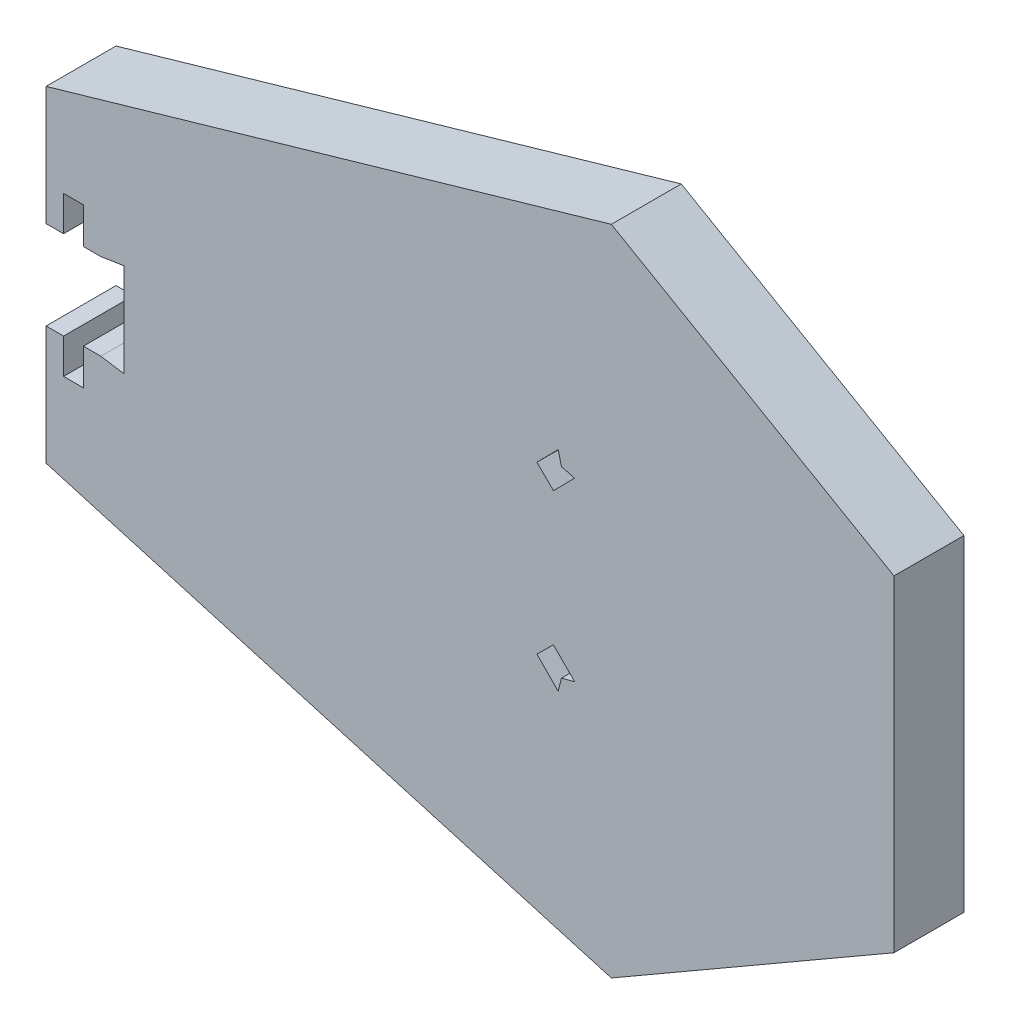
ISO-10303-21;
HEADER;
FILE_DESCRIPTION(('STEP AP214'),'2;1');
FILE_NAME('part.step','',(''),(''),'','','');
FILE_SCHEMA(('AUTOMOTIVE_DESIGN { 1 0 10303 214 1 1 1 1 }'));
ENDSEC;
DATA;
#1=APPLICATION_CONTEXT('core data for automotive mechanical design processes');
#2=APPLICATION_PROTOCOL_DEFINITION('international standard','automotive_design',2000,#1);
#3=PRODUCT_CONTEXT('',#1,'mechanical');
#4=PRODUCT('Part','Part','',(#3));
#5=PRODUCT_RELATED_PRODUCT_CATEGORY('part','',(#4));
#6=PRODUCT_DEFINITION_FORMATION('','',#4);
#7=PRODUCT_DEFINITION_CONTEXT('part definition',#1,'design');
#8=PRODUCT_DEFINITION('design','',#6,#7);
#9=PRODUCT_DEFINITION_SHAPE('','',#8);
#10=(LENGTH_UNIT() NAMED_UNIT(*) SI_UNIT(.MILLI.,.METRE.));
#11=(NAMED_UNIT(*) PLANE_ANGLE_UNIT() SI_UNIT($,.RADIAN.));
#12=(NAMED_UNIT(*) SI_UNIT($,.STERADIAN.) SOLID_ANGLE_UNIT());
#13=UNCERTAINTY_MEASURE_WITH_UNIT(LENGTH_MEASURE(1.E-05),#10,'distance_accuracy_value','');
#14=(GEOMETRIC_REPRESENTATION_CONTEXT(3) GLOBAL_UNCERTAINTY_ASSIGNED_CONTEXT((#13)) GLOBAL_UNIT_ASSIGNED_CONTEXT((#10,
#11,#12)) REPRESENTATION_CONTEXT('',''));
#15=CARTESIAN_POINT('',(0.,0.,0.));
#16=DIRECTION('',(0.,0.,1.));
#17=DIRECTION('',(1.,0.,0.));
#18=AXIS2_PLACEMENT_3D('',#15,#16,#17);
#19=CARTESIAN_POINT('',(-3.26682362399667,3.21868149985037,6.));
#20=DIRECTION('',(0.712336033670005,-0.701838567717168,0.));
#21=DIRECTION('',(0.701838567717168,0.712336033670005,0.));
#22=AXIS2_PLACEMENT_3D('',#19,#20,#21);
#23=PLANE('',#22);
#24=DIRECTION('',(-0.701838567717168,-0.712336033670005,0.));
#25=VECTOR('',#24,1.);
#26=CARTESIAN_POINT('',(-3.26682362399667,3.21868149985037,0.));
#27=LINE('',#26,#25);
#28=CARTESIAN_POINT('',(2.4087145761827,8.97910926261704,0.));
#29=VERTEX_POINT('',#28);
#30=CARTESIAN_POINT('',(0.584447895170022,7.12755685201684,0.));
#31=VERTEX_POINT('',#30);
#32=EDGE_CURVE('E399',#29,#31,#27,.T.);
#33=ORIENTED_EDGE('',*,*,#32,.F.);
#34=DIRECTION('',(0.,0.,-1.));
#35=VECTOR('',#34,1.);
#36=CARTESIAN_POINT('',(2.4087145761827,8.97910926261704,6.));
#37=LINE('',#36,#35);
#38=CARTESIAN_POINT('',(2.4087145761827,8.97910926261704,6.));
#39=VERTEX_POINT('',#38);
#40=EDGE_CURVE('E422',#39,#29,#37,.T.);
#41=ORIENTED_EDGE('',*,*,#40,.F.);
#42=DIRECTION('',(-0.701838567717168,-0.712336033670005,0.));
#43=VECTOR('',#42,1.);
#44=CARTESIAN_POINT('',(-3.26682362399667,3.21868149985037,6.));
#45=LINE('',#44,#43);
#46=CARTESIAN_POINT('',(0.584447895170022,7.12755685201684,6.));
#47=VERTEX_POINT('',#46);
#48=EDGE_CURVE('E343',#39,#47,#45,.T.);
#49=ORIENTED_EDGE('',*,*,#48,.T.);
#50=DIRECTION('',(0.,0.,-1.));
#51=VECTOR('',#50,1.);
#52=CARTESIAN_POINT('',(0.584447895170022,7.12755685201684,6.));
#53=LINE('',#52,#51);
#54=EDGE_CURVE('E413',#47,#31,#53,.T.);
#55=ORIENTED_EDGE('',*,*,#54,.T.);
#56=EDGE_LOOP('',(#33,#41,#49,#55));
#57=FACE_BOUND('',#56,.T.);
#58=ADVANCED_FACE('F35',(#57),#23,.T.);
#59=CARTESIAN_POINT('',(4.43325491605289,1.14578469708355,6.));
#60=DIRECTION('',(-0.968186432146917,-0.250229959450548,0.));
#61=DIRECTION('',(0.250229959450548,-0.968186432146917,0.));
#62=AXIS2_PLACEMENT_3D('',#59,#60,#61);
#63=PLANE('',#62);
#64=DIRECTION('',(-0.250229959450548,0.968186432146917,0.));
#65=VECTOR('',#64,1.);
#66=CARTESIAN_POINT('',(4.43325491605289,1.14578469708355,0.));
#67=LINE('',#66,#65);
#68=CARTESIAN_POINT('',(2.7004254455055,7.85042544550625,0.));
#69=VERTEX_POINT('',#68);
#70=EDGE_CURVE('E402',#69,#29,#67,.T.);
#71=ORIENTED_EDGE('',*,*,#70,.F.);
#72=DIRECTION('',(0.,0.,-1.));
#73=VECTOR('',#72,1.);
#74=CARTESIAN_POINT('',(2.7004254455055,7.85042544550625,6.));
#75=LINE('',#74,#73);
#76=CARTESIAN_POINT('',(2.7004254455055,7.85042544550625,6.));
#77=VERTEX_POINT('',#76);
#78=EDGE_CURVE('E420',#77,#69,#75,.T.);
#79=ORIENTED_EDGE('',*,*,#78,.F.);
#80=DIRECTION('',(-0.250229959450548,0.968186432146917,0.));
#81=VECTOR('',#80,1.);
#82=CARTESIAN_POINT('',(4.43325491605289,1.14578469708355,6.));
#83=LINE('',#82,#81);
#84=EDGE_CURVE('E346',#77,#39,#83,.T.);
#85=ORIENTED_EDGE('',*,*,#84,.T.);
#86=ORIENTED_EDGE('',*,*,#40,.T.);
#87=EDGE_LOOP('',(#71,#79,#85,#86));
#88=FACE_BOUND('',#87,.T.);
#89=ADVANCED_FACE('F546',(#88),#63,.T.);
#90=CARTESIAN_POINT('',(2.07100392519156,8.01310085209733,6.));
#91=DIRECTION('',(-0.250229959450549,-0.968186432146917,0.));
#92=DIRECTION('',(0.968186432146917,-0.250229959450549,0.));
#93=AXIS2_PLACEMENT_3D('',#90,#91,#92);
#94=PLANE('',#93);
#95=DIRECTION('',(-0.968186432146917,0.250229959450549,0.));
#96=VECTOR('',#95,1.);
#97=CARTESIAN_POINT('',(2.07100392519156,8.01310085209733,0.));
#98=LINE('',#97,#96);
#99=CARTESIAN_POINT('',(3.81927842247489,7.56125537891345,0.));
#100=VERTEX_POINT('',#99);
#101=EDGE_CURVE('E405',#100,#69,#98,.T.);
#102=ORIENTED_EDGE('',*,*,#101,.F.);
#103=DIRECTION('',(0.,0.,-1.));
#104=VECTOR('',#103,1.);
#105=CARTESIAN_POINT('',(3.81927842247489,7.56125537891345,6.));
#106=LINE('',#105,#104);
#107=CARTESIAN_POINT('',(3.81927842247489,7.56125537891345,6.));
#108=VERTEX_POINT('',#107);
#109=EDGE_CURVE('E418',#108,#100,#106,.T.);
#110=ORIENTED_EDGE('',*,*,#109,.F.);
#111=DIRECTION('',(-0.968186432146917,0.250229959450549,0.));
#112=VECTOR('',#111,1.);
#113=CARTESIAN_POINT('',(2.07100392519156,8.01310085209733,6.));
#114=LINE('',#113,#112);
#115=EDGE_CURVE('E349',#108,#77,#114,.T.);
#116=ORIENTED_EDGE('',*,*,#115,.T.);
#117=ORIENTED_EDGE('',*,*,#78,.T.);
#118=EDGE_LOOP('',(#102,#110,#116,#117));
#119=FACE_BOUND('',#118,.T.);
#120=ADVANCED_FACE('F552',(#119),#94,.T.);
#121=CARTESIAN_POINT('',(-1.84222279419438,1.81507455214917,6.));
#122=DIRECTION('',(-0.712336033670005,0.701838567717168,0.));
#123=DIRECTION('',(-0.701838567717168,-0.712336033670005,0.));
#124=AXIS2_PLACEMENT_3D('',#121,#122,#123);
#125=PLANE('',#124);
#126=DIRECTION('',(0.701838567717168,0.712336033670005,0.));
#127=VECTOR('',#126,1.);
#128=CARTESIAN_POINT('',(-1.84222279419438,1.81507455214917,0.));
#129=LINE('',#128,#127);
#130=CARTESIAN_POINT('',(2.00904872497232,5.72394990431564,0.));
#131=VERTEX_POINT('',#130);
#132=EDGE_CURVE('E408',#131,#100,#129,.T.);
#133=ORIENTED_EDGE('',*,*,#132,.F.);
#134=DIRECTION('',(0.,0.,-1.));
#135=VECTOR('',#134,1.);
#136=CARTESIAN_POINT('',(2.00904872497232,5.72394990431564,6.));
#137=LINE('',#136,#135);
#138=CARTESIAN_POINT('',(2.00904872497232,5.72394990431564,6.));
#139=VERTEX_POINT('',#138);
#140=EDGE_CURVE('E415',#139,#131,#137,.T.);
#141=ORIENTED_EDGE('',*,*,#140,.F.);
#142=DIRECTION('',(0.701838567717168,0.712336033670005,0.));
#143=VECTOR('',#142,1.);
#144=CARTESIAN_POINT('',(-1.84222279419438,1.81507455214917,6.));
#145=LINE('',#144,#143);
#146=EDGE_CURVE('E352',#139,#108,#145,.T.);
#147=ORIENTED_EDGE('',*,*,#146,.T.);
#148=ORIENTED_EDGE('',*,*,#109,.T.);
#149=EDGE_LOOP('',(#133,#141,#147,#148));
#150=FACE_BOUND('',#149,.T.);
#151=ADVANCED_FACE('F577',(#150),#125,.T.);
#152=CARTESIAN_POINT('',(2.07100392519156,-8.01310085209733,6.));
#153=DIRECTION('',(0.250229959450549,-0.968186432146917,0.));
#154=DIRECTION('',(0.968186432146917,0.250229959450549,0.));
#155=AXIS2_PLACEMENT_3D('',#152,#153,#154);
#156=PLANE('',#155);
#157=DIRECTION('',(-0.968186432146917,-0.250229959450549,0.));
#158=VECTOR('',#157,1.);
#159=CARTESIAN_POINT('',(2.07100392519156,-8.01310085209733,0.));
#160=LINE('',#159,#158);
#161=CARTESIAN_POINT('',(3.81927842247489,-7.56125537891345,0.));
#162=VERTEX_POINT('',#161);
#163=CARTESIAN_POINT('',(2.7004254455055,-7.85042544550625,0.));
#164=VERTEX_POINT('',#163);
#165=EDGE_CURVE('E388',#162,#164,#160,.T.);
#166=ORIENTED_EDGE('',*,*,#165,.T.);
#167=DIRECTION('',(0.,0.,-1.));
#168=VECTOR('',#167,1.);
#169=CARTESIAN_POINT('',(2.7004254455055,-7.85042544550625,6.));
#170=LINE('',#169,#168);
#171=CARTESIAN_POINT('',(2.7004254455055,-7.85042544550625,6.));
#172=VERTEX_POINT('',#171);
#173=EDGE_CURVE('E416',#172,#164,#170,.T.);
#174=ORIENTED_EDGE('',*,*,#173,.F.);
#175=DIRECTION('',(-0.968186432146917,-0.250229959450549,0.));
#176=VECTOR('',#175,1.);
#177=CARTESIAN_POINT('',(2.07100392519156,-8.01310085209733,6.));
#178=LINE('',#177,#176);
#179=CARTESIAN_POINT('',(3.81927842247489,-7.56125537891345,6.));
#180=VERTEX_POINT('',#179);
#181=EDGE_CURVE('E332',#180,#172,#178,.T.);
#182=ORIENTED_EDGE('',*,*,#181,.F.);
#183=DIRECTION('',(0.,0.,-1.));
#184=VECTOR('',#183,1.);
#185=CARTESIAN_POINT('',(3.81927842247489,-7.56125537891345,6.));
#186=LINE('',#185,#184);
#187=EDGE_CURVE('E424',#180,#162,#186,.T.);
#188=ORIENTED_EDGE('',*,*,#187,.T.);
#189=EDGE_LOOP('',(#166,#174,#182,#188));
#190=FACE_BOUND('',#189,.T.);
#191=ADVANCED_FACE('F573',(#190),#156,.F.);
#192=CARTESIAN_POINT('',(4.43325491605289,-1.14578469708355,6.));
#193=DIRECTION('',(0.968186432146917,-0.250229959450548,0.));
#194=DIRECTION('',(0.250229959450548,0.968186432146917,0.));
#195=AXIS2_PLACEMENT_3D('',#192,#193,#194);
#196=PLANE('',#195);
#197=DIRECTION('',(-0.250229959450548,-0.968186432146917,0.));
#198=VECTOR('',#197,1.);
#199=CARTESIAN_POINT('',(4.43325491605289,-1.14578469708355,0.));
#200=LINE('',#199,#198);
#201=CARTESIAN_POINT('',(2.4087145761827,-8.97910926261704,0.));
#202=VERTEX_POINT('',#201);
#203=EDGE_CURVE('E391',#164,#202,#200,.T.);
#204=ORIENTED_EDGE('',*,*,#203,.T.);
#205=DIRECTION('',(0.,0.,-1.));
#206=VECTOR('',#205,1.);
#207=CARTESIAN_POINT('',(2.4087145761827,-8.97910926261704,6.));
#208=LINE('',#207,#206);
#209=CARTESIAN_POINT('',(2.4087145761827,-8.97910926261704,6.));
#210=VERTEX_POINT('',#209);
#211=EDGE_CURVE('E434',#210,#202,#208,.T.);
#212=ORIENTED_EDGE('',*,*,#211,.F.);
#213=DIRECTION('',(-0.250229959450548,-0.968186432146917,0.));
#214=VECTOR('',#213,1.);
#215=CARTESIAN_POINT('',(4.43325491605289,-1.14578469708355,6.));
#216=LINE('',#215,#214);
#217=EDGE_CURVE('E335',#172,#210,#216,.T.);
#218=ORIENTED_EDGE('',*,*,#217,.F.);
#219=ORIENTED_EDGE('',*,*,#173,.T.);
#220=EDGE_LOOP('',(#204,#212,#218,#219));
#221=FACE_BOUND('',#220,.T.);
#222=ADVANCED_FACE('F569',(#221),#196,.F.);
#223=CARTESIAN_POINT('',(-3.26682362399667,-3.21868149985037,6.));
#224=DIRECTION('',(-0.712336033670005,-0.701838567717168,0.));
#225=DIRECTION('',(0.701838567717168,-0.712336033670005,0.));
#226=AXIS2_PLACEMENT_3D('',#223,#224,#225);
#227=PLANE('',#226);
#228=DIRECTION('',(-0.701838567717168,0.712336033670005,0.));
#229=VECTOR('',#228,1.);
#230=CARTESIAN_POINT('',(-3.26682362399667,-3.21868149985037,0.));
#231=LINE('',#230,#229);
#232=CARTESIAN_POINT('',(0.584447895170024,-7.12755685201684,0.));
#233=VERTEX_POINT('',#232);
#234=EDGE_CURVE('E393',#202,#233,#231,.T.);
#235=ORIENTED_EDGE('',*,*,#234,.T.);
#236=DIRECTION('',(0.,0.,-1.));
#237=VECTOR('',#236,1.);
#238=CARTESIAN_POINT('',(0.584447895170024,-7.12755685201684,6.));
#239=LINE('',#238,#237);
#240=CARTESIAN_POINT('',(0.584447895170024,-7.12755685201684,6.));
#241=VERTEX_POINT('',#240);
#242=EDGE_CURVE('E431',#241,#233,#239,.T.);
#243=ORIENTED_EDGE('',*,*,#242,.F.);
#244=DIRECTION('',(-0.701838567717168,0.712336033670005,0.));
#245=VECTOR('',#244,1.);
#246=CARTESIAN_POINT('',(-3.26682362399667,-3.21868149985037,6.));
#247=LINE('',#246,#245);
#248=EDGE_CURVE('E337',#210,#241,#247,.T.);
#249=ORIENTED_EDGE('',*,*,#248,.F.);
#250=ORIENTED_EDGE('',*,*,#211,.T.);
#251=EDGE_LOOP('',(#235,#243,#249,#250));
#252=FACE_BOUND('',#251,.T.);
#253=ADVANCED_FACE('F565',(#252),#227,.F.);
#254=CARTESIAN_POINT('',(3.8512715191667,-3.90887535216647,6.));
#255=DIRECTION('',(-0.701838567717168,0.712336033670004,0.));
#256=DIRECTION('',(-0.712336033670004,-0.701838567717168,0.));
#257=AXIS2_PLACEMENT_3D('',#254,#255,#256);
#258=PLANE('',#257);
#259=DIRECTION('',(0.712336033670004,0.701838567717168,0.));
#260=VECTOR('',#259,1.);
#261=CARTESIAN_POINT('',(3.8512715191667,-3.90887535216647,0.));
#262=LINE('',#261,#260);
#263=CARTESIAN_POINT('',(2.00904872497232,-5.72394990431564,0.));
#264=VERTEX_POINT('',#263);
#265=EDGE_CURVE('E395',#233,#264,#262,.T.);
#266=ORIENTED_EDGE('',*,*,#265,.T.);
#267=DIRECTION('',(0.,0.,-1.));
#268=VECTOR('',#267,1.);
#269=CARTESIAN_POINT('',(2.00904872497232,-5.72394990431564,6.));
#270=LINE('',#269,#268);
#271=CARTESIAN_POINT('',(2.00904872497232,-5.72394990431564,6.));
#272=VERTEX_POINT('',#271);
#273=EDGE_CURVE('E427',#272,#264,#270,.T.);
#274=ORIENTED_EDGE('',*,*,#273,.F.);
#275=DIRECTION('',(0.712336033670004,0.701838567717168,0.));
#276=VECTOR('',#275,1.);
#277=CARTESIAN_POINT('',(3.8512715191667,-3.90887535216647,6.));
#278=LINE('',#277,#276);
#279=EDGE_CURVE('E339',#241,#272,#278,.T.);
#280=ORIENTED_EDGE('',*,*,#279,.F.);
#281=ORIENTED_EDGE('',*,*,#242,.T.);
#282=EDGE_LOOP('',(#266,#274,#280,#281));
#283=FACE_BOUND('',#282,.T.);
#284=ADVANCED_FACE('F562',(#283),#258,.F.);
#285=CARTESIAN_POINT('',(31.2230669589464,0.,6.));
#286=DIRECTION('',(-1.,0.,0.));
#287=DIRECTION('',(0.,0.,1.));
#288=AXIS2_PLACEMENT_3D('',#285,#286,#287);
#289=PLANE('',#288);
#290=DIRECTION('',(0.,1.,0.));
#291=VECTOR('',#290,1.);
#292=CARTESIAN_POINT('',(31.2230669589464,0.,0.));
#293=LINE('',#292,#291);
#294=CARTESIAN_POINT('',(31.2230669589464,-14.,0.));
#295=VERTEX_POINT('',#294);
#296=CARTESIAN_POINT('',(31.2230669589464,14.,0.));
#297=VERTEX_POINT('',#296);
#298=EDGE_CURVE('E301',#295,#297,#293,.T.);
#299=ORIENTED_EDGE('',*,*,#298,.T.);
#300=DIRECTION('',(0.,0.,-1.));
#301=VECTOR('',#300,1.);
#302=CARTESIAN_POINT('',(31.2230669589464,14.,6.));
#303=LINE('',#302,#301);
#304=CARTESIAN_POINT('',(31.2230669589464,14.,6.));
#305=VERTEX_POINT('',#304);
#306=EDGE_CURVE('E428',#305,#297,#303,.T.);
#307=ORIENTED_EDGE('',*,*,#306,.F.);
#308=DIRECTION('',(0.,1.,0.));
#309=VECTOR('',#308,1.);
#310=CARTESIAN_POINT('',(31.2230669589464,0.,6.));
#311=LINE('',#310,#309);
#312=CARTESIAN_POINT('',(31.2230669589464,-14.,6.));
#313=VERTEX_POINT('',#312);
#314=EDGE_CURVE('E302',#313,#305,#311,.T.);
#315=ORIENTED_EDGE('',*,*,#314,.F.);
#316=DIRECTION('',(0.,0.,-1.));
#317=VECTOR('',#316,1.);
#318=CARTESIAN_POINT('',(31.2230669589464,-14.,6.));
#319=LINE('',#318,#317);
#320=EDGE_CURVE('E358',#313,#295,#319,.T.);
#321=ORIENTED_EDGE('',*,*,#320,.T.);
#322=EDGE_LOOP('',(#299,#307,#315,#321));
#323=FACE_BOUND('',#322,.T.);
#324=ADVANCED_FACE('F37',(#323),#289,.F.);
#325=CARTESIAN_POINT('',(13.8679445662277,24.0199845852551,6.));
#326=DIRECTION('',(-0.5,-0.866025403784438,0.));
#327=DIRECTION('',(0.866025403784439,-0.5,0.));
#328=AXIS2_PLACEMENT_3D('',#325,#326,#327);
#329=PLANE('',#328);
#330=DIRECTION('',(-0.866025403784439,0.5,0.));
#331=VECTOR('',#330,1.);
#332=CARTESIAN_POINT('',(13.8679445662277,24.0199845852551,0.));
#333=LINE('',#332,#331);
#334=CARTESIAN_POINT('',(6.97435565298217,28.,0.));
#335=VERTEX_POINT('',#334);
#336=EDGE_CURVE('E361',#297,#335,#333,.T.);
#337=ORIENTED_EDGE('',*,*,#336,.T.);
#338=DIRECTION('',(0.,0.,-1.));
#339=VECTOR('',#338,1.);
#340=CARTESIAN_POINT('',(6.97435565298217,28.,6.));
#341=LINE('',#340,#339);
#342=CARTESIAN_POINT('',(6.97435565298217,28.,6.));
#343=VERTEX_POINT('',#342);
#344=EDGE_CURVE('E460',#343,#335,#341,.T.);
#345=ORIENTED_EDGE('',*,*,#344,.F.);
#346=DIRECTION('',(-0.866025403784439,0.5,0.));
#347=VECTOR('',#346,1.);
#348=CARTESIAN_POINT('',(13.8679445662277,24.0199845852551,6.));
#349=LINE('',#348,#347);
#350=EDGE_CURVE('E305',#305,#343,#349,.T.);
#351=ORIENTED_EDGE('',*,*,#350,.F.);
#352=ORIENTED_EDGE('',*,*,#306,.T.);
#353=EDGE_LOOP('',(#337,#345,#351,#352));
#354=FACE_BOUND('',#353,.T.);
#355=ADVANCED_FACE('F465',(#354),#329,.F.);
#356=CARTESIAN_POINT('',(-6.92465304391345,23.9877017936892,6.));
#357=DIRECTION('',(-0.277350098112614,0.960768922830523,0.));
#358=DIRECTION('',(-0.960768922830523,-0.277350098112614,0.));
#359=AXIS2_PLACEMENT_3D('',#356,#357,#358);
#360=PLANE('',#359);
#361=DIRECTION('',(0.960768922830523,0.277350098112614,0.));
#362=VECTOR('',#361,1.);
#363=CARTESIAN_POINT('',(-6.92465304391345,23.9877017936892,0.));
#364=LINE('',#363,#362);
#365=CARTESIAN_POINT('',(-41.5230669589465,14.,0.));
#366=VERTEX_POINT('',#365);
#367=EDGE_CURVE('E364',#366,#335,#364,.T.);
#368=ORIENTED_EDGE('',*,*,#367,.F.);
#369=DIRECTION('',(0.,0.,-1.));
#370=VECTOR('',#369,1.);
#371=CARTESIAN_POINT('',(-41.5230669589465,14.,6.));
#372=LINE('',#371,#370);
#373=CARTESIAN_POINT('',(-41.5230669589465,14.,6.));
#374=VERTEX_POINT('',#373);
#375=EDGE_CURVE('E458',#374,#366,#372,.T.);
#376=ORIENTED_EDGE('',*,*,#375,.F.);
#377=DIRECTION('',(0.960768922830523,0.277350098112614,0.));
#378=VECTOR('',#377,1.);
#379=CARTESIAN_POINT('',(-6.92465304391345,23.9877017936892,6.));
#380=LINE('',#379,#378);
#381=EDGE_CURVE('E308',#374,#343,#380,.T.);
#382=ORIENTED_EDGE('',*,*,#381,.T.);
#383=ORIENTED_EDGE('',*,*,#344,.T.);
#384=EDGE_LOOP('',(#368,#376,#382,#383));
#385=FACE_BOUND('',#384,.T.);
#386=ADVANCED_FACE('F476',(#385),#360,.T.);
#387=CARTESIAN_POINT('',(-41.5230669589465,0.,6.));
#388=DIRECTION('',(1.,0.,0.));
#389=DIRECTION('',(0.,0.,-1.));
#390=AXIS2_PLACEMENT_3D('',#387,#388,#389);
#391=PLANE('',#390);
#392=DIRECTION('',(0.,-1.,0.));
#393=VECTOR('',#392,1.);
#394=CARTESIAN_POINT('',(-41.5230669589465,0.,0.));
#395=LINE('',#394,#393);
#396=CARTESIAN_POINT('',(-41.5230669589465,3.79999999999952,0.));
#397=VERTEX_POINT('',#396);
#398=EDGE_CURVE('E367',#366,#397,#395,.T.);
#399=ORIENTED_EDGE('',*,*,#398,.T.);
#400=DIRECTION('',(0.,0.,1.));
#401=VECTOR('',#400,1.);
#402=CARTESIAN_POINT('',(-41.5230669589465,3.79999999999952,6.));
#403=LINE('',#402,#401);
#404=CARTESIAN_POINT('',(-41.5230669589465,3.79999999999952,6.));
#405=VERTEX_POINT('',#404);
#406=EDGE_CURVE('E298',#397,#405,#403,.T.);
#407=ORIENTED_EDGE('',*,*,#406,.T.);
#408=DIRECTION('',(0.,-1.,0.));
#409=VECTOR('',#408,1.);
#410=CARTESIAN_POINT('',(-41.5230669589465,0.,6.));
#411=LINE('',#410,#409);
#412=EDGE_CURVE('E311',#374,#405,#411,.T.);
#413=ORIENTED_EDGE('',*,*,#412,.F.);
#414=ORIENTED_EDGE('',*,*,#375,.T.);
#415=EDGE_LOOP('',(#399,#407,#413,#414));
#416=FACE_BOUND('',#415,.T.);
#417=ADVANCED_FACE('F535',(#416),#391,.F.);
#418=CARTESIAN_POINT('',(0.,3.7,6.));
#419=DIRECTION('',(0.,1.,0.));
#420=DIRECTION('',(-1.,0.,0.));
#421=AXIS2_PLACEMENT_3D('',#418,#419,#420);
#422=PLANE('',#421);
#423=DIRECTION('',(1.,0.,0.));
#424=VECTOR('',#423,1.);
#425=CARTESIAN_POINT('',(0.,3.7,6.));
#426=LINE('',#425,#424);
#427=CARTESIAN_POINT('',(-38.3230669589467,3.7,6.));
#428=VERTEX_POINT('',#427);
#429=CARTESIAN_POINT('',(-36.8230669589465,3.7,6.));
#430=VERTEX_POINT('',#429);
#431=EDGE_CURVE('E314',#428,#430,#426,.T.);
#432=ORIENTED_EDGE('',*,*,#431,.F.);
#433=DIRECTION('',(0.,0.,-1.));
#434=VECTOR('',#433,1.);
#435=CARTESIAN_POINT('',(-38.3230669589467,3.7,6.));
#436=LINE('',#435,#434);
#437=CARTESIAN_POINT('',(-38.3230669589467,3.7,0.));
#438=VERTEX_POINT('',#437);
#439=EDGE_CURVE('E295',#428,#438,#436,.T.);
#440=ORIENTED_EDGE('',*,*,#439,.T.);
#441=DIRECTION('',(1.,0.,0.));
#442=VECTOR('',#441,1.);
#443=CARTESIAN_POINT('',(0.,3.7,0.));
#444=LINE('',#443,#442);
#445=CARTESIAN_POINT('',(-36.8230669589465,3.7,0.));
#446=VERTEX_POINT('',#445);
#447=EDGE_CURVE('E370',#438,#446,#444,.T.);
#448=ORIENTED_EDGE('',*,*,#447,.T.);
#449=DIRECTION('',(0.,0.,-1.));
#450=VECTOR('',#449,1.);
#451=CARTESIAN_POINT('',(-36.8230669589465,3.7,6.));
#452=LINE('',#451,#450);
#453=EDGE_CURVE('E455',#430,#446,#452,.T.);
#454=ORIENTED_EDGE('',*,*,#453,.F.);
#455=EDGE_LOOP('',(#432,#440,#448,#454));
#456=FACE_BOUND('',#455,.T.);
#457=ADVANCED_FACE('F522',(#456),#422,.F.);
#458=CARTESIAN_POINT('',(-1.46534877253605,9.28195054774533,6.));
#459=DIRECTION('',(-0.155939485229701,0.987766610564609,0.));
#460=DIRECTION('',(-0.987766610564609,-0.155939485229701,0.));
#461=AXIS2_PLACEMENT_3D('',#458,#459,#460);
#462=PLANE('',#461);
#463=DIRECTION('',(0.987766610564609,0.155939485229701,0.));
#464=VECTOR('',#463,1.);
#465=CARTESIAN_POINT('',(-1.46534877253605,9.28195054774533,0.));
#466=LINE('',#465,#464);
#467=CARTESIAN_POINT('',(-34.8230669589465,4.01574155992288,0.));
#468=VERTEX_POINT('',#467);
#469=EDGE_CURVE('E372',#446,#468,#466,.T.);
#470=ORIENTED_EDGE('',*,*,#469,.T.);
#471=DIRECTION('',(0.,0.,-1.));
#472=VECTOR('',#471,1.);
#473=CARTESIAN_POINT('',(-34.8230669589465,4.01574155992288,6.));
#474=LINE('',#473,#472);
#475=CARTESIAN_POINT('',(-34.8230669589465,4.01574155992288,6.));
#476=VERTEX_POINT('',#475);
#477=EDGE_CURVE('E452',#476,#468,#474,.T.);
#478=ORIENTED_EDGE('',*,*,#477,.F.);
#479=DIRECTION('',(0.987766610564609,0.155939485229701,0.));
#480=VECTOR('',#479,1.);
#481=CARTESIAN_POINT('',(-1.46534877253605,9.28195054774533,6.));
#482=LINE('',#481,#480);
#483=EDGE_CURVE('E316',#430,#476,#482,.T.);
#484=ORIENTED_EDGE('',*,*,#483,.F.);
#485=ORIENTED_EDGE('',*,*,#453,.T.);
#486=EDGE_LOOP('',(#470,#478,#484,#485));
#487=FACE_BOUND('',#486,.T.);
#488=ADVANCED_FACE('F517',(#487),#462,.F.);
#489=CARTESIAN_POINT('',(-34.8230669589465,0.,6.));
#490=DIRECTION('',(1.,0.,0.));
#491=DIRECTION('',(0.,0.,-1.));
#492=AXIS2_PLACEMENT_3D('',#489,#490,#491);
#493=PLANE('',#492);
#494=DIRECTION('',(0.,-1.,0.));
#495=VECTOR('',#494,1.);
#496=CARTESIAN_POINT('',(-34.8230669589465,0.,0.));
#497=LINE('',#496,#495);
#498=CARTESIAN_POINT('',(-34.8230669589465,-4.01574155992288,0.));
#499=VERTEX_POINT('',#498);
#500=EDGE_CURVE('E374',#468,#499,#497,.T.);
#501=ORIENTED_EDGE('',*,*,#500,.T.);
#502=DIRECTION('',(0.,0.,-1.));
#503=VECTOR('',#502,1.);
#504=CARTESIAN_POINT('',(-34.8230669589465,-4.01574155992288,6.));
#505=LINE('',#504,#503);
#506=CARTESIAN_POINT('',(-34.8230669589465,-4.01574155992288,6.));
#507=VERTEX_POINT('',#506);
#508=EDGE_CURVE('E449',#507,#499,#505,.T.);
#509=ORIENTED_EDGE('',*,*,#508,.F.);
#510=DIRECTION('',(0.,-1.,0.));
#511=VECTOR('',#510,1.);
#512=CARTESIAN_POINT('',(-34.8230669589465,0.,6.));
#513=LINE('',#512,#511);
#514=EDGE_CURVE('E318',#476,#507,#513,.T.);
#515=ORIENTED_EDGE('',*,*,#514,.F.);
#516=ORIENTED_EDGE('',*,*,#477,.T.);
#517=EDGE_LOOP('',(#501,#509,#515,#516));
#518=FACE_BOUND('',#517,.T.);
#519=ADVANCED_FACE('F513',(#518),#493,.F.);
#520=CARTESIAN_POINT('',(-1.46534877253605,-9.28195054774533,6.));
#521=DIRECTION('',(-0.155939485229701,-0.987766610564609,0.));
#522=DIRECTION('',(0.987766610564609,-0.155939485229701,0.));
#523=AXIS2_PLACEMENT_3D('',#520,#521,#522);
#524=PLANE('',#523);
#525=DIRECTION('',(-0.987766610564609,0.155939485229701,0.));
#526=VECTOR('',#525,1.);
#527=CARTESIAN_POINT('',(-1.46534877253605,-9.28195054774533,0.));
#528=LINE('',#527,#526);
#529=CARTESIAN_POINT('',(-36.8230669589465,-3.7,0.));
#530=VERTEX_POINT('',#529);
#531=EDGE_CURVE('E376',#499,#530,#528,.T.);
#532=ORIENTED_EDGE('',*,*,#531,.T.);
#533=DIRECTION('',(0.,0.,-1.));
#534=VECTOR('',#533,1.);
#535=CARTESIAN_POINT('',(-36.8230669589465,-3.7,6.));
#536=LINE('',#535,#534);
#537=CARTESIAN_POINT('',(-36.8230669589465,-3.7,6.));
#538=VERTEX_POINT('',#537);
#539=EDGE_CURVE('E446',#538,#530,#536,.T.);
#540=ORIENTED_EDGE('',*,*,#539,.F.);
#541=DIRECTION('',(-0.987766610564609,0.155939485229701,0.));
#542=VECTOR('',#541,1.);
#543=CARTESIAN_POINT('',(-1.46534877253605,-9.28195054774533,6.));
#544=LINE('',#543,#542);
#545=EDGE_CURVE('E320',#507,#538,#544,.T.);
#546=ORIENTED_EDGE('',*,*,#545,.F.);
#547=ORIENTED_EDGE('',*,*,#508,.T.);
#548=EDGE_LOOP('',(#532,#540,#546,#547));
#549=FACE_BOUND('',#548,.T.);
#550=ADVANCED_FACE('F508',(#549),#524,.F.);
#551=CARTESIAN_POINT('',(0.,-3.7,6.));
#552=DIRECTION('',(0.,-1.,0.));
#553=DIRECTION('',(1.,0.,0.));
#554=AXIS2_PLACEMENT_3D('',#551,#552,#553);
#555=PLANE('',#554);
#556=DIRECTION('',(-1.,0.,0.));
#557=VECTOR('',#556,1.);
#558=CARTESIAN_POINT('',(0.,-3.7,0.));
#559=LINE('',#558,#557);
#560=CARTESIAN_POINT('',(-38.3230669589467,-3.7,0.));
#561=VERTEX_POINT('',#560);
#562=EDGE_CURVE('E378',#530,#561,#559,.T.);
#563=ORIENTED_EDGE('',*,*,#562,.T.);
#564=DIRECTION('',(0.,0.,1.));
#565=VECTOR('',#564,1.);
#566=CARTESIAN_POINT('',(-38.3230669589467,-3.7,6.));
#567=LINE('',#566,#565);
#568=CARTESIAN_POINT('',(-38.3230669589467,-3.7,6.));
#569=VERTEX_POINT('',#568);
#570=EDGE_CURVE('E292',#561,#569,#567,.T.);
#571=ORIENTED_EDGE('',*,*,#570,.T.);
#572=DIRECTION('',(-1.,0.,0.));
#573=VECTOR('',#572,1.);
#574=CARTESIAN_POINT('',(0.,-3.7,6.));
#575=LINE('',#574,#573);
#576=EDGE_CURVE('E322',#538,#569,#575,.T.);
#577=ORIENTED_EDGE('',*,*,#576,.F.);
#578=ORIENTED_EDGE('',*,*,#539,.T.);
#579=EDGE_LOOP('',(#563,#571,#577,#578));
#580=FACE_BOUND('',#579,.T.);
#581=ADVANCED_FACE('F501',(#580),#555,.F.);
#582=CARTESIAN_POINT('',(-41.5230669589465,0.,6.));
#583=DIRECTION('',(1.,0.,0.));
#584=DIRECTION('',(0.,0.,-1.));
#585=AXIS2_PLACEMENT_3D('',#582,#583,#584);
#586=PLANE('',#585);
#587=DIRECTION('',(0.,-1.,0.));
#588=VECTOR('',#587,1.);
#589=CARTESIAN_POINT('',(-41.5230669589465,0.,6.));
#590=LINE('',#589,#588);
#591=CARTESIAN_POINT('',(-41.5230669589465,-3.80000000000048,6.));
#592=VERTEX_POINT('',#591);
#593=CARTESIAN_POINT('',(-41.5230669589465,-14.,6.));
#594=VERTEX_POINT('',#593);
#595=EDGE_CURVE('E325',#592,#594,#590,.T.);
#596=ORIENTED_EDGE('',*,*,#595,.F.);
#597=DIRECTION('',(0.,0.,-1.));
#598=VECTOR('',#597,1.);
#599=CARTESIAN_POINT('',(-41.5230669589465,-3.80000000000048,6.));
#600=LINE('',#599,#598);
#601=CARTESIAN_POINT('',(-41.5230669589465,-3.80000000000048,0.));
#602=VERTEX_POINT('',#601);
#603=EDGE_CURVE('E283',#592,#602,#600,.T.);
#604=ORIENTED_EDGE('',*,*,#603,.T.);
#605=DIRECTION('',(0.,-1.,0.));
#606=VECTOR('',#605,1.);
#607=CARTESIAN_POINT('',(-41.5230669589465,0.,0.));
#608=LINE('',#607,#606);
#609=CARTESIAN_POINT('',(-41.5230669589465,-14.,0.));
#610=VERTEX_POINT('',#609);
#611=EDGE_CURVE('E381',#602,#610,#608,.T.);
#612=ORIENTED_EDGE('',*,*,#611,.T.);
#613=DIRECTION('',(0.,0.,-1.));
#614=VECTOR('',#613,1.);
#615=CARTESIAN_POINT('',(-41.5230669589465,-14.,6.));
#616=LINE('',#615,#614);
#617=EDGE_CURVE('E443',#594,#610,#616,.T.);
#618=ORIENTED_EDGE('',*,*,#617,.F.);
#619=EDGE_LOOP('',(#596,#604,#612,#618));
#620=FACE_BOUND('',#619,.T.);
#621=ADVANCED_FACE('F492',(#620),#586,.F.);
#622=CARTESIAN_POINT('',(-6.92465304391345,-23.9877017936892,6.));
#623=DIRECTION('',(-0.277350098112614,-0.960768922830523,0.));
#624=DIRECTION('',(0.960768922830523,-0.277350098112614,0.));
#625=AXIS2_PLACEMENT_3D('',#622,#623,#624);
#626=PLANE('',#625);
#627=DIRECTION('',(-0.960768922830523,0.277350098112614,0.));
#628=VECTOR('',#627,1.);
#629=CARTESIAN_POINT('',(-6.92465304391345,-23.9877017936892,0.));
#630=LINE('',#629,#628);
#631=CARTESIAN_POINT('',(6.97435565298217,-28.,0.));
#632=VERTEX_POINT('',#631);
#633=EDGE_CURVE('E383',#632,#610,#630,.T.);
#634=ORIENTED_EDGE('',*,*,#633,.F.);
#635=DIRECTION('',(0.,0.,-1.));
#636=VECTOR('',#635,1.);
#637=CARTESIAN_POINT('',(6.97435565298217,-28.,6.));
#638=LINE('',#637,#636);
#639=CARTESIAN_POINT('',(6.97435565298217,-28.,6.));
#640=VERTEX_POINT('',#639);
#641=EDGE_CURVE('E441',#640,#632,#638,.T.);
#642=ORIENTED_EDGE('',*,*,#641,.F.);
#643=DIRECTION('',(-0.960768922830523,0.277350098112614,0.));
#644=VECTOR('',#643,1.);
#645=CARTESIAN_POINT('',(-6.92465304391345,-23.9877017936892,6.));
#646=LINE('',#645,#644);
#647=EDGE_CURVE('E327',#640,#594,#646,.T.);
#648=ORIENTED_EDGE('',*,*,#647,.T.);
#649=ORIENTED_EDGE('',*,*,#617,.T.);
#650=EDGE_LOOP('',(#634,#642,#648,#649));
#651=FACE_BOUND('',#650,.T.);
#652=ADVANCED_FACE('F488',(#651),#626,.T.);
#653=CARTESIAN_POINT('',(-1.84222279419438,-1.81507455214917,6.));
#654=DIRECTION('',(0.712336033670005,0.701838567717168,0.));
#655=DIRECTION('',(-0.701838567717168,0.712336033670005,0.));
#656=AXIS2_PLACEMENT_3D('',#653,#654,#655);
#657=PLANE('',#656);
#658=DIRECTION('',(0.701838567717168,-0.712336033670005,0.));
#659=VECTOR('',#658,1.);
#660=CARTESIAN_POINT('',(-1.84222279419438,-1.81507455214917,0.));
#661=LINE('',#660,#659);
#662=EDGE_CURVE('E397',#264,#162,#661,.T.);
#663=ORIENTED_EDGE('',*,*,#662,.T.);
#664=ORIENTED_EDGE('',*,*,#187,.F.);
#665=DIRECTION('',(0.701838567717168,-0.712336033670005,0.));
#666=VECTOR('',#665,1.);
#667=CARTESIAN_POINT('',(-1.84222279419438,-1.81507455214917,6.));
#668=LINE('',#667,#666);
#669=EDGE_CURVE('E341',#272,#180,#668,.T.);
#670=ORIENTED_EDGE('',*,*,#669,.F.);
#671=ORIENTED_EDGE('',*,*,#273,.T.);
#672=EDGE_LOOP('',(#663,#664,#670,#671));
#673=FACE_BOUND('',#672,.T.);
#674=ADVANCED_FACE('F558',(#673),#657,.F.);
#675=CARTESIAN_POINT('',(13.8679445662277,-24.0199845852551,6.));
#676=DIRECTION('',(-0.5,0.866025403784438,0.));
#677=DIRECTION('',(-0.866025403784439,-0.5,0.));
#678=AXIS2_PLACEMENT_3D('',#675,#676,#677);
#679=PLANE('',#678);
#680=DIRECTION('',(0.866025403784439,0.5,0.));
#681=VECTOR('',#680,1.);
#682=CARTESIAN_POINT('',(13.8679445662277,-24.0199845852551,0.));
#683=LINE('',#682,#681);
#684=EDGE_CURVE('E386',#632,#295,#683,.T.);
#685=ORIENTED_EDGE('',*,*,#684,.T.);
#686=ORIENTED_EDGE('',*,*,#320,.F.);
#687=DIRECTION('',(0.866025403784439,0.5,0.));
#688=VECTOR('',#687,1.);
#689=CARTESIAN_POINT('',(13.8679445662277,-24.0199845852551,6.));
#690=LINE('',#689,#688);
#691=EDGE_CURVE('E330',#640,#313,#690,.T.);
#692=ORIENTED_EDGE('',*,*,#691,.F.);
#693=ORIENTED_EDGE('',*,*,#641,.T.);
#694=EDGE_LOOP('',(#685,#686,#692,#693));
#695=FACE_BOUND('',#694,.T.);
#696=ADVANCED_FACE('F486',(#695),#679,.F.);
#697=CARTESIAN_POINT('',(3.8512715191667,3.90887535216647,6.));
#698=DIRECTION('',(0.701838567717168,0.712336033670004,0.));
#699=DIRECTION('',(-0.712336033670004,0.701838567717168,0.));
#700=AXIS2_PLACEMENT_3D('',#697,#698,#699);
#701=PLANE('',#700);
#702=DIRECTION('',(0.712336033670004,-0.701838567717168,0.));
#703=VECTOR('',#702,1.);
#704=CARTESIAN_POINT('',(3.8512715191667,3.90887535216647,0.));
#705=LINE('',#704,#703);
#706=EDGE_CURVE('E306',#31,#131,#705,.T.);
#707=ORIENTED_EDGE('',*,*,#706,.F.);
#708=ORIENTED_EDGE('',*,*,#54,.F.);
#709=DIRECTION('',(0.712336033670004,-0.701838567717168,0.));
#710=VECTOR('',#709,1.);
#711=CARTESIAN_POINT('',(3.8512715191667,3.90887535216647,6.));
#712=LINE('',#711,#710);
#713=EDGE_CURVE('E355',#47,#139,#712,.T.);
#714=ORIENTED_EDGE('',*,*,#713,.T.);
#715=ORIENTED_EDGE('',*,*,#140,.T.);
#716=EDGE_LOOP('',(#707,#708,#714,#715));
#717=FACE_BOUND('',#716,.T.);
#718=ADVANCED_FACE('F581',(#717),#701,.T.);
#719=CARTESIAN_POINT('',(0.,0.,6.));
#720=DIRECTION('',(0.,0.,1.));
#721=DIRECTION('',(1.,0.,0.));
#722=AXIS2_PLACEMENT_3D('',#719,#720,#721);
#723=PLANE('',#722);
#724=DIRECTION('',(-1.,0.,0.));
#725=VECTOR('',#724,1.);
#726=CARTESIAN_POINT('',(-40.0230669589467,3.79999999999952,6.));
#727=LINE('',#726,#725);
#728=CARTESIAN_POINT('',(-40.0230669589467,3.79999999999952,6.));
#729=VERTEX_POINT('',#728);
#730=EDGE_CURVE('E256',#729,#405,#727,.T.);
#731=ORIENTED_EDGE('',*,*,#730,.F.);
#732=DIRECTION('',(0.,-1.,0.));
#733=VECTOR('',#732,1.);
#734=CARTESIAN_POINT('',(-40.0230669589467,6.79999999999952,6.));
#735=LINE('',#734,#733);
#736=CARTESIAN_POINT('',(-40.0230669589467,6.79999999999952,6.));
#737=VERTEX_POINT('',#736);
#738=EDGE_CURVE('E258',#737,#729,#735,.T.);
#739=ORIENTED_EDGE('',*,*,#738,.F.);
#740=DIRECTION('',(-1.,0.,0.));
#741=VECTOR('',#740,1.);
#742=CARTESIAN_POINT('',(-38.3230669589467,6.79999999999952,6.));
#743=LINE('',#742,#741);
#744=CARTESIAN_POINT('',(-38.3230669589467,6.79999999999952,6.));
#745=VERTEX_POINT('',#744);
#746=EDGE_CURVE('E276',#745,#737,#743,.T.);
#747=ORIENTED_EDGE('',*,*,#746,.F.);
#748=DIRECTION('',(0.,1.,0.));
#749=VECTOR('',#748,1.);
#750=CARTESIAN_POINT('',(-38.3230669589467,-6.80000000000048,6.));
#751=LINE('',#750,#749);
#752=EDGE_CURVE('E273',#428,#745,#751,.T.);
#753=ORIENTED_EDGE('',*,*,#752,.F.);
#754=ORIENTED_EDGE('',*,*,#431,.T.);
#755=ORIENTED_EDGE('',*,*,#483,.T.);
#756=ORIENTED_EDGE('',*,*,#514,.T.);
#757=ORIENTED_EDGE('',*,*,#545,.T.);
#758=ORIENTED_EDGE('',*,*,#576,.T.);
#759=CARTESIAN_POINT('',(-38.3230669589467,-6.80000000000048,6.));
#760=VERTEX_POINT('',#759);
#761=EDGE_CURVE('E274',#760,#569,#751,.T.);
#762=ORIENTED_EDGE('',*,*,#761,.F.);
#763=DIRECTION('',(1.,0.,0.));
#764=VECTOR('',#763,1.);
#765=CARTESIAN_POINT('',(-40.0230669589467,-6.80000000000048,6.));
#766=LINE('',#765,#764);
#767=CARTESIAN_POINT('',(-40.0230669589467,-6.80000000000048,6.));
#768=VERTEX_POINT('',#767);
#769=EDGE_CURVE('E271',#768,#760,#766,.T.);
#770=ORIENTED_EDGE('',*,*,#769,.F.);
#771=DIRECTION('',(0.,-1.,0.));
#772=VECTOR('',#771,1.);
#773=CARTESIAN_POINT('',(-40.0230669589467,-3.80000000000048,6.));
#774=LINE('',#773,#772);
#775=CARTESIAN_POINT('',(-40.0230669589467,-3.80000000000048,6.));
#776=VERTEX_POINT('',#775);
#777=EDGE_CURVE('E236',#776,#768,#774,.T.);
#778=ORIENTED_EDGE('',*,*,#777,.F.);
#779=DIRECTION('',(1.,0.,0.));
#780=VECTOR('',#779,1.);
#781=CARTESIAN_POINT('',(-41.6230669589467,-3.80000000000048,6.));
#782=LINE('',#781,#780);
#783=EDGE_CURVE('E268',#592,#776,#782,.T.);
#784=ORIENTED_EDGE('',*,*,#783,.F.);
#785=ORIENTED_EDGE('',*,*,#595,.T.);
#786=ORIENTED_EDGE('',*,*,#647,.F.);
#787=ORIENTED_EDGE('',*,*,#691,.T.);
#788=ORIENTED_EDGE('',*,*,#314,.T.);
#789=ORIENTED_EDGE('',*,*,#350,.T.);
#790=ORIENTED_EDGE('',*,*,#381,.F.);
#791=ORIENTED_EDGE('',*,*,#412,.T.);
#792=EDGE_LOOP('',(#731,#739,#747,#753,#754,#755,#756,#757,#758,#762,#770,#778,#784,#785,#786,
#787,#788,#789,#790,#791));
#793=FACE_BOUND('',#792,.T.);
#794=ORIENTED_EDGE('',*,*,#181,.T.);
#795=ORIENTED_EDGE('',*,*,#217,.T.);
#796=ORIENTED_EDGE('',*,*,#248,.T.);
#797=ORIENTED_EDGE('',*,*,#279,.T.);
#798=ORIENTED_EDGE('',*,*,#669,.T.);
#799=EDGE_LOOP('',(#794,#795,#796,#797,#798));
#800=FACE_BOUND('',#799,.T.);
#801=ORIENTED_EDGE('',*,*,#48,.F.);
#802=ORIENTED_EDGE('',*,*,#84,.F.);
#803=ORIENTED_EDGE('',*,*,#115,.F.);
#804=ORIENTED_EDGE('',*,*,#146,.F.);
#805=ORIENTED_EDGE('',*,*,#713,.F.);
#806=EDGE_LOOP('',(#801,#802,#803,#804,#805));
#807=FACE_BOUND('',#806,.T.);
#808=ADVANCED_FACE('F481',(#793,#800,#807),#723,.T.);
#809=CARTESIAN_POINT('',(0.,0.,0.));
#810=DIRECTION('',(0.,0.,1.));
#811=DIRECTION('',(1.,0.,0.));
#812=AXIS2_PLACEMENT_3D('',#809,#810,#811);
#813=PLANE('',#812);
#814=DIRECTION('',(0.,-1.,0.));
#815=VECTOR('',#814,1.);
#816=CARTESIAN_POINT('',(-40.0230669589467,6.79999999999952,0.));
#817=LINE('',#816,#815);
#818=CARTESIAN_POINT('',(-40.0230669589467,6.79999999999952,0.));
#819=VERTEX_POINT('',#818);
#820=CARTESIAN_POINT('',(-40.0230669589467,3.79999999999952,0.));
#821=VERTEX_POINT('',#820);
#822=EDGE_CURVE('E263',#819,#821,#817,.T.);
#823=ORIENTED_EDGE('',*,*,#822,.T.);
#824=DIRECTION('',(-1.,0.,0.));
#825=VECTOR('',#824,1.);
#826=CARTESIAN_POINT('',(-40.0230669589467,3.79999999999952,0.));
#827=LINE('',#826,#825);
#828=EDGE_CURVE('E265',#821,#397,#827,.T.);
#829=ORIENTED_EDGE('',*,*,#828,.T.);
#830=ORIENTED_EDGE('',*,*,#398,.F.);
#831=ORIENTED_EDGE('',*,*,#367,.T.);
#832=ORIENTED_EDGE('',*,*,#336,.F.);
#833=ORIENTED_EDGE('',*,*,#298,.F.);
#834=ORIENTED_EDGE('',*,*,#684,.F.);
#835=ORIENTED_EDGE('',*,*,#633,.T.);
#836=ORIENTED_EDGE('',*,*,#611,.F.);
#837=DIRECTION('',(1.,0.,0.));
#838=VECTOR('',#837,1.);
#839=CARTESIAN_POINT('',(0.,-3.80000000000048,0.));
#840=LINE('',#839,#838);
#841=CARTESIAN_POINT('',(-40.0230669589467,-3.80000000000048,0.));
#842=VERTEX_POINT('',#841);
#843=EDGE_CURVE('E43',#602,#842,#840,.T.);
#844=ORIENTED_EDGE('',*,*,#843,.T.);
#845=DIRECTION('',(0.,-1.,0.));
#846=VECTOR('',#845,1.);
#847=CARTESIAN_POINT('',(-40.0230669589467,-3.80000000000048,0.));
#848=LINE('',#847,#846);
#849=CARTESIAN_POINT('',(-40.0230669589467,-6.80000000000048,0.));
#850=VERTEX_POINT('',#849);
#851=EDGE_CURVE('E58',#842,#850,#848,.T.);
#852=ORIENTED_EDGE('',*,*,#851,.T.);
#853=DIRECTION('',(1.,0.,0.));
#854=VECTOR('',#853,1.);
#855=CARTESIAN_POINT('',(-40.0230669589467,-6.80000000000048,0.));
#856=LINE('',#855,#854);
#857=CARTESIAN_POINT('',(-38.3230669589467,-6.80000000000048,0.));
#858=VERTEX_POINT('',#857);
#859=EDGE_CURVE('E244',#850,#858,#856,.T.);
#860=ORIENTED_EDGE('',*,*,#859,.T.);
#861=DIRECTION('',(0.,1.,0.));
#862=VECTOR('',#861,1.);
#863=CARTESIAN_POINT('',(-38.3230669589467,-6.80000000000048,0.));
#864=LINE('',#863,#862);
#865=EDGE_CURVE('E249',#858,#561,#864,.T.);
#866=ORIENTED_EDGE('',*,*,#865,.T.);
#867=ORIENTED_EDGE('',*,*,#562,.F.);
#868=ORIENTED_EDGE('',*,*,#531,.F.);
#869=ORIENTED_EDGE('',*,*,#500,.F.);
#870=ORIENTED_EDGE('',*,*,#469,.F.);
#871=ORIENTED_EDGE('',*,*,#447,.F.);
#872=DIRECTION('',(0.,1.,0.));
#873=VECTOR('',#872,1.);
#874=CARTESIAN_POINT('',(-38.3230669589467,0.,0.));
#875=LINE('',#874,#873);
#876=CARTESIAN_POINT('',(-38.3230669589467,6.79999999999952,0.));
#877=VERTEX_POINT('',#876);
#878=EDGE_CURVE('E11',#438,#877,#875,.T.);
#879=ORIENTED_EDGE('',*,*,#878,.T.);
#880=DIRECTION('',(-1.,0.,0.));
#881=VECTOR('',#880,1.);
#882=CARTESIAN_POINT('',(-38.3230669589467,6.79999999999952,0.));
#883=LINE('',#882,#881);
#884=EDGE_CURVE('E50',#877,#819,#883,.T.);
#885=ORIENTED_EDGE('',*,*,#884,.T.);
#886=EDGE_LOOP('',(#823,#829,#830,#831,#832,#833,#834,#835,#836,#844,#852,#860,#866,#867,#868,
#869,#870,#871,#879,#885));
#887=FACE_BOUND('',#886,.T.);
#888=ORIENTED_EDGE('',*,*,#165,.F.);
#889=ORIENTED_EDGE('',*,*,#662,.F.);
#890=ORIENTED_EDGE('',*,*,#265,.F.);
#891=ORIENTED_EDGE('',*,*,#234,.F.);
#892=ORIENTED_EDGE('',*,*,#203,.F.);
#893=EDGE_LOOP('',(#888,#889,#890,#891,#892));
#894=FACE_BOUND('',#893,.T.);
#895=ORIENTED_EDGE('',*,*,#32,.T.);
#896=ORIENTED_EDGE('',*,*,#706,.T.);
#897=ORIENTED_EDGE('',*,*,#132,.T.);
#898=ORIENTED_EDGE('',*,*,#101,.T.);
#899=ORIENTED_EDGE('',*,*,#70,.T.);
#900=EDGE_LOOP('',(#895,#896,#897,#898,#899));
#901=FACE_BOUND('',#900,.T.);
#902=ADVANCED_FACE('F253',(#887,#894,#901),#813,.F.);
#903=CARTESIAN_POINT('',(-41.6230669589467,-3.80000000000048,0.));
#904=DIRECTION('',(0.,-1.,0.));
#905=DIRECTION('',(0.,0.,-1.));
#906=AXIS2_PLACEMENT_3D('',#903,#904,#905);
#907=PLANE('',#906);
#908=ORIENTED_EDGE('',*,*,#783,.T.);
#909=DIRECTION('',(0.,0.,1.));
#910=VECTOR('',#909,1.);
#911=CARTESIAN_POINT('',(-40.0230669589467,-3.80000000000048,0.));
#912=LINE('',#911,#910);
#913=EDGE_CURVE('E241',#842,#776,#912,.T.);
#914=ORIENTED_EDGE('',*,*,#913,.F.);
#915=ORIENTED_EDGE('',*,*,#843,.F.);
#916=ORIENTED_EDGE('',*,*,#603,.F.);
#917=EDGE_LOOP('',(#908,#914,#915,#916));
#918=FACE_BOUND('',#917,.T.);
#919=ADVANCED_FACE('F495',(#918),#907,.F.);
#920=CARTESIAN_POINT('',(-40.0230669589467,-3.80000000000048,0.));
#921=DIRECTION('',(-1.,0.,0.));
#922=DIRECTION('',(0.,0.,1.));
#923=AXIS2_PLACEMENT_3D('',#920,#921,#922);
#924=PLANE('',#923);
#925=ORIENTED_EDGE('',*,*,#777,.T.);
#926=DIRECTION('',(0.,0.,1.));
#927=VECTOR('',#926,1.);
#928=CARTESIAN_POINT('',(-40.0230669589467,-6.80000000000048,0.));
#929=LINE('',#928,#927);
#930=EDGE_CURVE('E232',#850,#768,#929,.T.);
#931=ORIENTED_EDGE('',*,*,#930,.F.);
#932=ORIENTED_EDGE('',*,*,#851,.F.);
#933=ORIENTED_EDGE('',*,*,#913,.T.);
#934=EDGE_LOOP('',(#925,#931,#932,#933));
#935=FACE_BOUND('',#934,.T.);
#936=ADVANCED_FACE('F234',(#935),#924,.F.);
#937=CARTESIAN_POINT('',(-40.0230669589467,-6.80000000000048,0.));
#938=DIRECTION('',(0.,-1.,0.));
#939=DIRECTION('',(0.,0.,-1.));
#940=AXIS2_PLACEMENT_3D('',#937,#938,#939);
#941=PLANE('',#940);
#942=ORIENTED_EDGE('',*,*,#769,.T.);
#943=DIRECTION('',(0.,0.,1.));
#944=VECTOR('',#943,1.);
#945=CARTESIAN_POINT('',(-38.3230669589467,-6.80000000000048,0.));
#946=LINE('',#945,#944);
#947=EDGE_CURVE('E240',#858,#760,#946,.T.);
#948=ORIENTED_EDGE('',*,*,#947,.F.);
#949=ORIENTED_EDGE('',*,*,#859,.F.);
#950=ORIENTED_EDGE('',*,*,#930,.T.);
#951=EDGE_LOOP('',(#942,#948,#949,#950));
#952=FACE_BOUND('',#951,.T.);
#953=ADVANCED_FACE('F245',(#952),#941,.F.);
#954=CARTESIAN_POINT('',(-38.3230669589467,-6.80000000000048,0.));
#955=DIRECTION('',(1.,0.,0.));
#956=DIRECTION('',(0.,0.,-1.));
#957=AXIS2_PLACEMENT_3D('',#954,#955,#956);
#958=PLANE('',#957);
#959=ORIENTED_EDGE('',*,*,#865,.F.);
#960=ORIENTED_EDGE('',*,*,#947,.T.);
#961=ORIENTED_EDGE('',*,*,#761,.T.);
#962=ORIENTED_EDGE('',*,*,#570,.F.);
#963=EDGE_LOOP('',(#959,#960,#961,#962));
#964=FACE_BOUND('',#963,.T.);
#965=ADVANCED_FACE('F499',(#964),#958,.F.);
#966=CARTESIAN_POINT('',(-40.0230669589467,3.79999999999952,0.));
#967=DIRECTION('',(0.,1.,0.));
#968=DIRECTION('',(-1.,0.,0.));
#969=AXIS2_PLACEMENT_3D('',#966,#967,#968);
#970=PLANE('',#969);
#971=ORIENTED_EDGE('',*,*,#828,.F.);
#972=DIRECTION('',(0.,0.,1.));
#973=VECTOR('',#972,1.);
#974=CARTESIAN_POINT('',(-40.0230669589467,3.79999999999952,0.));
#975=LINE('',#974,#973);
#976=EDGE_CURVE('E281',#821,#729,#975,.T.);
#977=ORIENTED_EDGE('',*,*,#976,.T.);
#978=ORIENTED_EDGE('',*,*,#730,.T.);
#979=ORIENTED_EDGE('',*,*,#406,.F.);
#980=EDGE_LOOP('',(#971,#977,#978,#979));
#981=FACE_BOUND('',#980,.T.);
#982=ADVANCED_FACE('F536',(#981),#970,.F.);
#983=ORIENTED_EDGE('',*,*,#752,.T.);
#984=DIRECTION('',(0.,0.,1.));
#985=VECTOR('',#984,1.);
#986=CARTESIAN_POINT('',(-38.3230669589467,6.79999999999952,0.));
#987=LINE('',#986,#985);
#988=EDGE_CURVE('E286',#877,#745,#987,.T.);
#989=ORIENTED_EDGE('',*,*,#988,.F.);
#990=ORIENTED_EDGE('',*,*,#878,.F.);
#991=ORIENTED_EDGE('',*,*,#439,.F.);
#992=EDGE_LOOP('',(#983,#989,#990,#991));
#993=FACE_BOUND('',#992,.T.);
#994=ADVANCED_FACE('F525',(#993),#958,.F.);
#995=CARTESIAN_POINT('',(-40.0230669589467,6.79999999999952,0.));
#996=DIRECTION('',(-1.,0.,0.));
#997=DIRECTION('',(0.,0.,1.));
#998=AXIS2_PLACEMENT_3D('',#995,#996,#997);
#999=PLANE('',#998);
#1000=ORIENTED_EDGE('',*,*,#738,.T.);
#1001=ORIENTED_EDGE('',*,*,#976,.F.);
#1002=ORIENTED_EDGE('',*,*,#822,.F.);
#1003=DIRECTION('',(0.,0.,1.));
#1004=VECTOR('',#1003,1.);
#1005=CARTESIAN_POINT('',(-40.0230669589467,6.79999999999952,0.));
#1006=LINE('',#1005,#1004);
#1007=EDGE_CURVE('E284',#819,#737,#1006,.T.);
#1008=ORIENTED_EDGE('',*,*,#1007,.T.);
#1009=EDGE_LOOP('',(#1000,#1001,#1002,#1008));
#1010=FACE_BOUND('',#1009,.T.);
#1011=ADVANCED_FACE('F531',(#1010),#999,.F.);
#1012=CARTESIAN_POINT('',(-38.3230669589467,6.79999999999952,0.));
#1013=DIRECTION('',(0.,1.,0.));
#1014=DIRECTION('',(0.,0.,1.));
#1015=AXIS2_PLACEMENT_3D('',#1012,#1013,#1014);
#1016=PLANE('',#1015);
#1017=ORIENTED_EDGE('',*,*,#746,.T.);
#1018=ORIENTED_EDGE('',*,*,#1007,.F.);
#1019=ORIENTED_EDGE('',*,*,#884,.F.);
#1020=ORIENTED_EDGE('',*,*,#988,.T.);
#1021=EDGE_LOOP('',(#1017,#1018,#1019,#1020));
#1022=FACE_BOUND('',#1021,.T.);
#1023=ADVANCED_FACE('F528',(#1022),#1016,.F.);
#1024=CLOSED_SHELL('',(#58,#89,#120,#151,#191,#222,#253,#284,#324,#355,#386,#417,#457,#488,#519,
#550,#581,#621,#652,#674,#696,#718,#808,#902,#919,#936,#953,#965,#982,#994,#1011,#1023));
#1025=MANIFOLD_SOLID_BREP('B2',#1024);
#1026=ADVANCED_BREP_SHAPE_REPRESENTATION('',(#18,#1025),#14);
#1027=SHAPE_DEFINITION_REPRESENTATION(#9,#1026);
ENDSEC;
END-ISO-10303-21;
